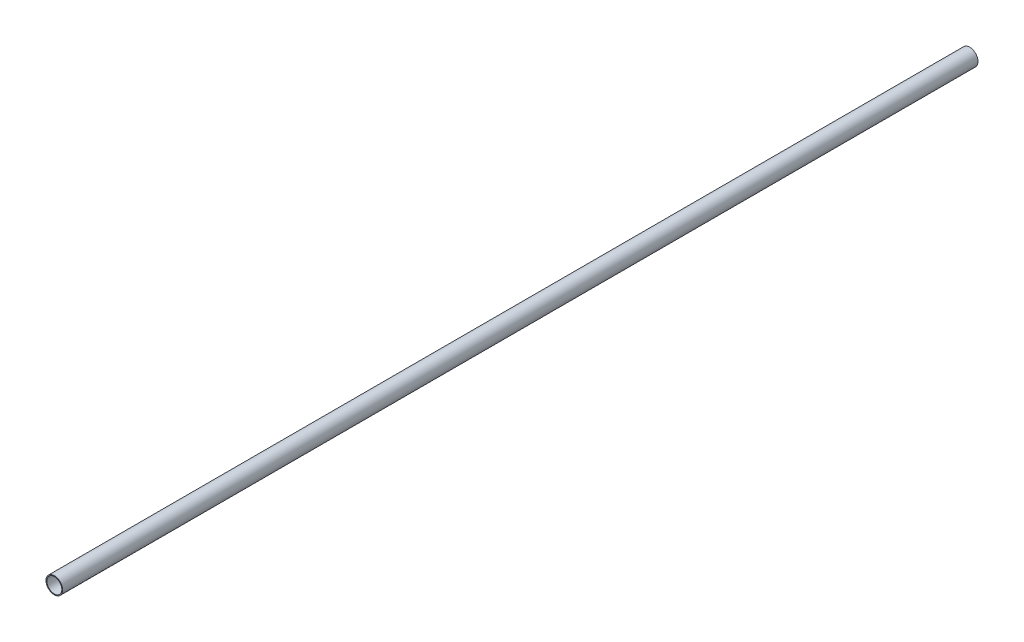
ISO-10303-21;
HEADER;
FILE_DESCRIPTION(('STEP AP214'),'2;1');
FILE_NAME('part.step','',(''),(''),'','','');
FILE_SCHEMA(('AUTOMOTIVE_DESIGN { 1 0 10303 214 1 1 1 1 }'));
ENDSEC;
DATA;
#1=APPLICATION_CONTEXT('core data for automotive mechanical design processes');
#2=APPLICATION_PROTOCOL_DEFINITION('international standard','automotive_design',2000,#1);
#3=PRODUCT_CONTEXT('',#1,'mechanical');
#4=PRODUCT('Part','Part','',(#3));
#5=PRODUCT_RELATED_PRODUCT_CATEGORY('part','',(#4));
#6=PRODUCT_DEFINITION_FORMATION('','',#4);
#7=PRODUCT_DEFINITION_CONTEXT('part definition',#1,'design');
#8=PRODUCT_DEFINITION('design','',#6,#7);
#9=PRODUCT_DEFINITION_SHAPE('','',#8);
#10=(LENGTH_UNIT() NAMED_UNIT(*) SI_UNIT(.MILLI.,.METRE.));
#11=(NAMED_UNIT(*) PLANE_ANGLE_UNIT() SI_UNIT($,.RADIAN.));
#12=(NAMED_UNIT(*) SI_UNIT($,.STERADIAN.) SOLID_ANGLE_UNIT());
#13=UNCERTAINTY_MEASURE_WITH_UNIT(LENGTH_MEASURE(1.E-05),#10,'distance_accuracy_value','');
#14=(GEOMETRIC_REPRESENTATION_CONTEXT(3) GLOBAL_UNCERTAINTY_ASSIGNED_CONTEXT((#13)) GLOBAL_UNIT_ASSIGNED_CONTEXT((#10,
#11,#12)) REPRESENTATION_CONTEXT('',''));
#15=CARTESIAN_POINT('',(0.,0.,0.));
#16=DIRECTION('',(0.,0.,1.));
#17=DIRECTION('',(1.,0.,0.));
#18=AXIS2_PLACEMENT_3D('',#15,#16,#17);
#19=CARTESIAN_POINT('',(0.,0.,550.));
#20=DIRECTION('',(0.,0.,1.));
#21=DIRECTION('',(1.,0.,0.));
#22=AXIS2_PLACEMENT_3D('',#19,#20,#21);
#23=PLANE('',#22);
#24=CARTESIAN_POINT('',(0.,0.,550.));
#25=DIRECTION('',(0.,0.,1.));
#26=DIRECTION('',(1.,0.,0.));
#27=AXIS2_PLACEMENT_3D('',#24,#25,#26);
#28=CIRCLE('',#27,10.);
#29=CARTESIAN_POINT('',(10.,0.,550.));
#30=VERTEX_POINT('',#29);
#31=EDGE_CURVE('E10',#30,#30,#28,.T.);
#32=ORIENTED_EDGE('',*,*,#31,.T.);
#33=EDGE_LOOP('',(#32));
#34=FACE_BOUND('',#33,.T.);
#35=CARTESIAN_POINT('',(0.,0.,550.));
#36=DIRECTION('',(0.,0.,1.));
#37=DIRECTION('',(1.,0.,0.));
#38=AXIS2_PLACEMENT_3D('',#35,#36,#37);
#39=CIRCLE('',#38,9.);
#40=CARTESIAN_POINT('',(9.,0.,550.));
#41=VERTEX_POINT('',#40);
#42=EDGE_CURVE('E47',#41,#41,#39,.T.);
#43=ORIENTED_EDGE('',*,*,#42,.F.);
#44=EDGE_LOOP('',(#43));
#45=FACE_BOUND('',#44,.T.);
#46=ADVANCED_FACE('F36',(#34,#45),#23,.T.);
#47=CARTESIAN_POINT('',(0.,0.,-550.));
#48=DIRECTION('',(0.,0.,1.));
#49=DIRECTION('',(1.,0.,0.));
#50=AXIS2_PLACEMENT_3D('',#47,#48,#49);
#51=PLANE('',#50);
#52=CARTESIAN_POINT('',(0.,0.,-550.));
#53=DIRECTION('',(0.,0.,1.));
#54=DIRECTION('',(1.,0.,0.));
#55=AXIS2_PLACEMENT_3D('',#52,#53,#54);
#56=CIRCLE('',#55,10.);
#57=CARTESIAN_POINT('',(10.,0.,-550.));
#58=VERTEX_POINT('',#57);
#59=EDGE_CURVE('E40',#58,#58,#56,.T.);
#60=ORIENTED_EDGE('',*,*,#59,.F.);
#61=EDGE_LOOP('',(#60));
#62=FACE_BOUND('',#61,.T.);
#63=CARTESIAN_POINT('',(0.,0.,-550.));
#64=DIRECTION('',(0.,0.,1.));
#65=DIRECTION('',(1.,0.,0.));
#66=AXIS2_PLACEMENT_3D('',#63,#64,#65);
#67=CIRCLE('',#66,9.);
#68=CARTESIAN_POINT('',(9.,0.,-550.));
#69=VERTEX_POINT('',#68);
#70=EDGE_CURVE('E49',#69,#69,#67,.T.);
#71=ORIENTED_EDGE('',*,*,#70,.T.);
#72=EDGE_LOOP('',(#71));
#73=FACE_BOUND('',#72,.T.);
#74=ADVANCED_FACE('F59',(#62,#73),#51,.F.);
#75=CARTESIAN_POINT('',(0.,0.,550.));
#76=DIRECTION('',(0.,0.,-1.));
#77=DIRECTION('',(-1.,0.,0.));
#78=AXIS2_PLACEMENT_3D('',#75,#76,#77);
#79=CYLINDRICAL_SURFACE('',#78,10.);
#80=ORIENTED_EDGE('',*,*,#31,.F.);
#81=EDGE_LOOP('',(#80));
#82=FACE_BOUND('',#81,.T.);
#83=ORIENTED_EDGE('',*,*,#59,.T.);
#84=EDGE_LOOP('',(#83));
#85=FACE_BOUND('',#84,.T.);
#86=ADVANCED_FACE('F38',(#82,#85),#79,.T.);
#87=CARTESIAN_POINT('',(0.,0.,550.));
#88=DIRECTION('',(0.,0.,-1.));
#89=DIRECTION('',(-1.,0.,0.));
#90=AXIS2_PLACEMENT_3D('',#87,#88,#89);
#91=CYLINDRICAL_SURFACE('',#90,9.);
#92=ORIENTED_EDGE('',*,*,#42,.T.);
#93=EDGE_LOOP('',(#92));
#94=FACE_BOUND('',#93,.T.);
#95=ORIENTED_EDGE('',*,*,#70,.F.);
#96=EDGE_LOOP('',(#95));
#97=FACE_BOUND('',#96,.T.);
#98=ADVANCED_FACE('F55',(#94,#97),#91,.F.);
#99=CLOSED_SHELL('',(#46,#74,#86,#98));
#100=MANIFOLD_SOLID_BREP('B2',#99);
#101=ADVANCED_BREP_SHAPE_REPRESENTATION('',(#18,#100),#14);
#102=SHAPE_DEFINITION_REPRESENTATION(#9,#101);
ENDSEC;
END-ISO-10303-21;
